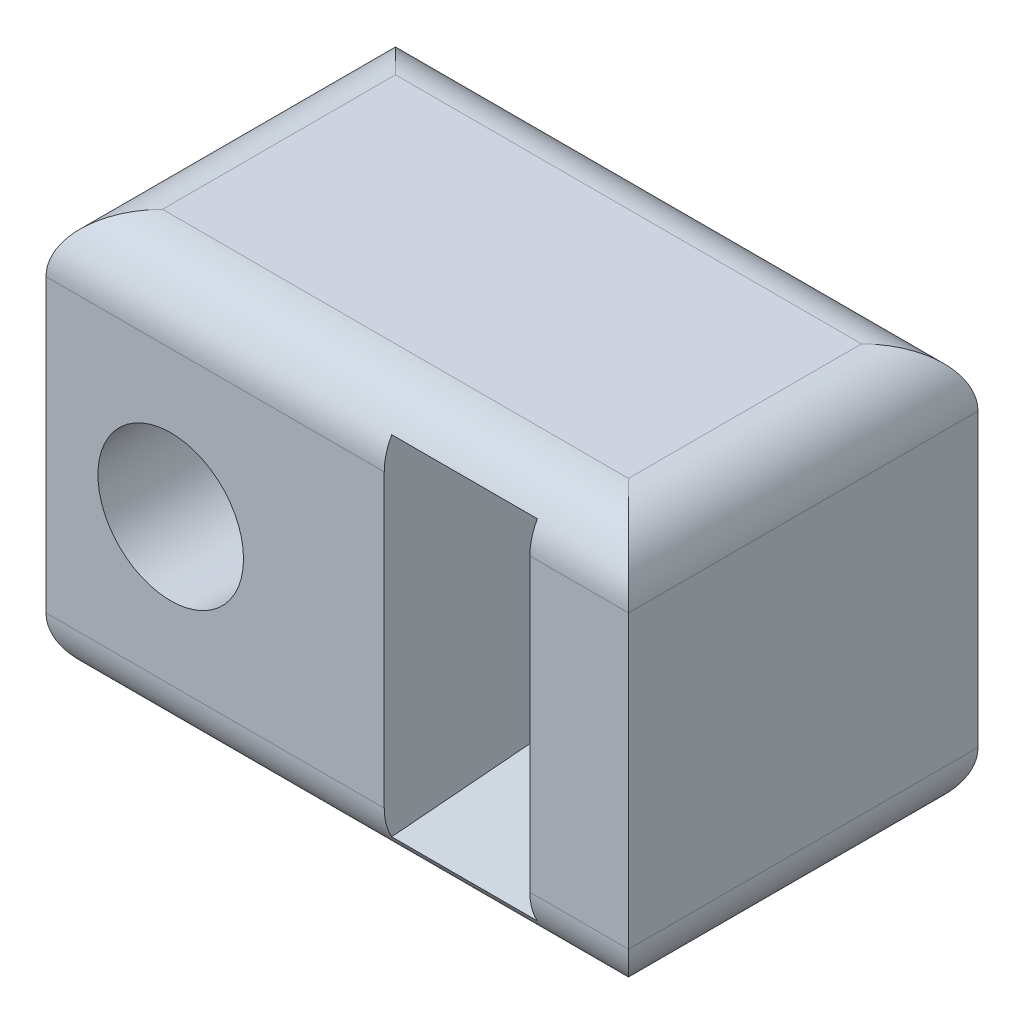
ISO-10303-21;
HEADER;
FILE_DESCRIPTION(('STEP AP214'),'2;1');
FILE_NAME('part.step','',(''),(''),'','','');
FILE_SCHEMA(('AUTOMOTIVE_DESIGN { 1 0 10303 214 1 1 1 1 }'));
ENDSEC;
DATA;
#1=APPLICATION_CONTEXT('core data for automotive mechanical design processes');
#2=APPLICATION_PROTOCOL_DEFINITION('international standard','automotive_design',2000,#1);
#3=PRODUCT_CONTEXT('',#1,'mechanical');
#4=PRODUCT('Part','Part','',(#3));
#5=PRODUCT_RELATED_PRODUCT_CATEGORY('part','',(#4));
#6=PRODUCT_DEFINITION_FORMATION('','',#4);
#7=PRODUCT_DEFINITION_CONTEXT('part definition',#1,'design');
#8=PRODUCT_DEFINITION('design','',#6,#7);
#9=PRODUCT_DEFINITION_SHAPE('','',#8);
#10=(LENGTH_UNIT() NAMED_UNIT(*) SI_UNIT(.MILLI.,.METRE.));
#11=(NAMED_UNIT(*) PLANE_ANGLE_UNIT() SI_UNIT($,.RADIAN.));
#12=(NAMED_UNIT(*) SI_UNIT($,.STERADIAN.) SOLID_ANGLE_UNIT());
#13=UNCERTAINTY_MEASURE_WITH_UNIT(LENGTH_MEASURE(1.E-05),#10,'distance_accuracy_value','');
#14=(GEOMETRIC_REPRESENTATION_CONTEXT(3) GLOBAL_UNCERTAINTY_ASSIGNED_CONTEXT((#13)) GLOBAL_UNIT_ASSIGNED_CONTEXT((#10,
#11,#12)) REPRESENTATION_CONTEXT('',''));
#15=CARTESIAN_POINT('',(0.,0.,0.));
#16=DIRECTION('',(0.,0.,1.));
#17=DIRECTION('',(1.,0.,0.));
#18=AXIS2_PLACEMENT_3D('',#15,#16,#17);
#19=CARTESIAN_POINT('',(0.,0.,6.));
#20=DIRECTION('',(0.,0.,-1.));
#21=DIRECTION('',(-1.,0.,0.));
#22=AXIS2_PLACEMENT_3D('',#19,#20,#21);
#23=PLANE('',#22);
#24=DIRECTION('',(0.,1.,0.));
#25=VECTOR('',#24,1.);
#26=CARTESIAN_POINT('',(5.,-3.5,6.));
#27=LINE('',#26,#25);
#28=CARTESIAN_POINT('',(5.,-2.5,6.));
#29=VERTEX_POINT('',#28);
#30=CARTESIAN_POINT('',(5.,2.5,6.));
#31=VERTEX_POINT('',#30);
#32=EDGE_CURVE('E217',#29,#31,#27,.T.);
#33=ORIENTED_EDGE('',*,*,#32,.T.);
#34=DIRECTION('',(1.,0.,0.));
#35=VECTOR('',#34,1.);
#36=CARTESIAN_POINT('',(-5.,2.5,6.));
#37=LINE('',#36,#35);
#38=CARTESIAN_POINT('',(3.30660422270358,2.5,6.));
#39=VERTEX_POINT('',#38);
#40=EDGE_CURVE('E323',#31,#39,#37,.F.);
#41=ORIENTED_EDGE('',*,*,#40,.T.);
#42=DIRECTION('',(0.,1.,0.));
#43=VECTOR('',#42,1.);
#44=CARTESIAN_POINT('',(3.30660422270358,-3.,6.));
#45=LINE('',#44,#43);
#46=CARTESIAN_POINT('',(3.30660422270358,-2.5,6.));
#47=VERTEX_POINT('',#46);
#48=EDGE_CURVE('E203',#47,#39,#45,.T.);
#49=ORIENTED_EDGE('',*,*,#48,.F.);
#50=DIRECTION('',(1.,0.,0.));
#51=VECTOR('',#50,1.);
#52=CARTESIAN_POINT('',(0.,-2.5,6.));
#53=LINE('',#52,#51);
#54=EDGE_CURVE('E202',#47,#29,#53,.T.);
#55=ORIENTED_EDGE('',*,*,#54,.T.);
#56=EDGE_LOOP('',(#33,#41,#49,#55));
#57=FACE_BOUND('',#56,.T.);
#58=ADVANCED_FACE('F41',(#57),#23,.F.);
#59=CARTESIAN_POINT('',(0.,0.,0.));
#60=DIRECTION('',(0.,0.,-1.));
#61=DIRECTION('',(-1.,0.,0.));
#62=AXIS2_PLACEMENT_3D('',#59,#60,#61);
#63=PLANE('',#62);
#64=DIRECTION('',(0.,1.,0.));
#65=VECTOR('',#64,1.);
#66=CARTESIAN_POINT('',(5.,-3.5,0.));
#67=LINE('',#66,#65);
#68=CARTESIAN_POINT('',(5.,-2.5,0.));
#69=VERTEX_POINT('',#68);
#70=CARTESIAN_POINT('',(5.,2.5,0.));
#71=VERTEX_POINT('',#70);
#72=EDGE_CURVE('E232',#69,#71,#67,.T.);
#73=ORIENTED_EDGE('',*,*,#72,.F.);
#74=DIRECTION('',(1.,0.,0.));
#75=VECTOR('',#74,1.);
#76=CARTESIAN_POINT('',(-5.,-2.5,0.));
#77=LINE('',#76,#75);
#78=CARTESIAN_POINT('',(3.30660422270358,-2.5,0.));
#79=VERTEX_POINT('',#78);
#80=EDGE_CURVE('E181',#69,#79,#77,.F.);
#81=ORIENTED_EDGE('',*,*,#80,.T.);
#82=DIRECTION('',(0.,-1.,0.));
#83=VECTOR('',#82,1.);
#84=CARTESIAN_POINT('',(3.30660422270358,-2.5,0.));
#85=LINE('',#84,#83);
#86=CARTESIAN_POINT('',(3.30660422270358,2.5,0.));
#87=VERTEX_POINT('',#86);
#88=EDGE_CURVE('E157',#87,#79,#85,.T.);
#89=ORIENTED_EDGE('',*,*,#88,.F.);
#90=DIRECTION('',(1.,0.,0.));
#91=VECTOR('',#90,1.);
#92=CARTESIAN_POINT('',(0.,2.5,0.));
#93=LINE('',#92,#91);
#94=EDGE_CURVE('E185',#87,#71,#93,.T.);
#95=ORIENTED_EDGE('',*,*,#94,.T.);
#96=EDGE_LOOP('',(#73,#81,#89,#95));
#97=FACE_BOUND('',#96,.T.);
#98=ADVANCED_FACE('F231',(#97),#63,.T.);
#99=CARTESIAN_POINT('',(-2.85886782280584,0.,6.));
#100=DIRECTION('',(0.,0.,1.));
#101=DIRECTION('',(1.,0.,0.));
#102=AXIS2_PLACEMENT_3D('',#99,#100,#101);
#103=CIRCLE('',#102,1.25);
#104=CARTESIAN_POINT('',(-1.60886782280584,0.,6.));
#105=VERTEX_POINT('',#104);
#106=EDGE_CURVE('E278',#105,#105,#103,.T.);
#107=ORIENTED_EDGE('',*,*,#106,.F.);
#108=EDGE_LOOP('',(#107));
#109=FACE_BOUND('',#108,.T.);
#110=DIRECTION('',(0.,-1.,0.));
#111=VECTOR('',#110,1.);
#112=CARTESIAN_POINT('',(0.806604222703576,-3.,6.));
#113=LINE('',#112,#111);
#114=CARTESIAN_POINT('',(0.806604222703577,2.5,6.));
#115=VERTEX_POINT('',#114);
#116=CARTESIAN_POINT('',(0.806604222703576,-2.5,6.));
#117=VERTEX_POINT('',#116);
#118=EDGE_CURVE('E207',#115,#117,#113,.T.);
#119=ORIENTED_EDGE('',*,*,#118,.F.);
#120=DIRECTION('',(1.,0.,0.));
#121=VECTOR('',#120,1.);
#122=CARTESIAN_POINT('',(-5.,2.5,6.));
#123=LINE('',#122,#121);
#124=CARTESIAN_POINT('',(-5.,2.5,6.));
#125=VERTEX_POINT('',#124);
#126=EDGE_CURVE('E328',#115,#125,#123,.F.);
#127=ORIENTED_EDGE('',*,*,#126,.T.);
#128=DIRECTION('',(0.,1.,0.));
#129=VECTOR('',#128,1.);
#130=CARTESIAN_POINT('',(-5.,-3.5,6.));
#131=LINE('',#130,#129);
#132=CARTESIAN_POINT('',(-5.,-2.5,6.));
#133=VERTEX_POINT('',#132);
#134=EDGE_CURVE('E242',#133,#125,#131,.T.);
#135=ORIENTED_EDGE('',*,*,#134,.F.);
#136=DIRECTION('',(1.,0.,0.));
#137=VECTOR('',#136,1.);
#138=CARTESIAN_POINT('',(0.,-2.5,6.));
#139=LINE('',#138,#137);
#140=EDGE_CURVE('E331',#133,#117,#139,.T.);
#141=ORIENTED_EDGE('',*,*,#140,.T.);
#142=EDGE_LOOP('',(#119,#127,#135,#141));
#143=FACE_BOUND('',#142,.T.);
#144=ADVANCED_FACE('F350',(#109,#143),#23,.F.);
#145=CARTESIAN_POINT('',(-2.85886782280584,0.,0.));
#146=DIRECTION('',(0.,0.,1.));
#147=DIRECTION('',(1.,0.,0.));
#148=AXIS2_PLACEMENT_3D('',#145,#146,#147);
#149=CIRCLE('',#148,1.25);
#150=CARTESIAN_POINT('',(-1.60886782280584,0.,0.));
#151=VERTEX_POINT('',#150);
#152=EDGE_CURVE('E174',#151,#151,#149,.T.);
#153=ORIENTED_EDGE('',*,*,#152,.T.);
#154=EDGE_LOOP('',(#153));
#155=FACE_BOUND('',#154,.T.);
#156=DIRECTION('',(0.,1.,0.));
#157=VECTOR('',#156,1.);
#158=CARTESIAN_POINT('',(0.806604222703576,-2.5,0.));
#159=LINE('',#158,#157);
#160=CARTESIAN_POINT('',(0.806604222703576,-2.5,0.));
#161=VERTEX_POINT('',#160);
#162=CARTESIAN_POINT('',(0.806604222703576,2.5,0.));
#163=VERTEX_POINT('',#162);
#164=EDGE_CURVE('E162',#161,#163,#159,.T.);
#165=ORIENTED_EDGE('',*,*,#164,.F.);
#166=DIRECTION('',(1.,0.,0.));
#167=VECTOR('',#166,1.);
#168=CARTESIAN_POINT('',(-5.,-2.5,0.));
#169=LINE('',#168,#167);
#170=CARTESIAN_POINT('',(-5.,-2.5,0.));
#171=VERTEX_POINT('',#170);
#172=EDGE_CURVE('E169',#161,#171,#169,.F.);
#173=ORIENTED_EDGE('',*,*,#172,.T.);
#174=DIRECTION('',(0.,1.,0.));
#175=VECTOR('',#174,1.);
#176=CARTESIAN_POINT('',(-5.,-3.5,0.));
#177=LINE('',#176,#175);
#178=CARTESIAN_POINT('',(-5.,2.5,0.));
#179=VERTEX_POINT('',#178);
#180=EDGE_CURVE('E243',#171,#179,#177,.T.);
#181=ORIENTED_EDGE('',*,*,#180,.T.);
#182=DIRECTION('',(1.,0.,0.));
#183=VECTOR('',#182,1.);
#184=CARTESIAN_POINT('',(0.,2.5,0.));
#185=LINE('',#184,#183);
#186=EDGE_CURVE('E172',#179,#163,#185,.T.);
#187=ORIENTED_EDGE('',*,*,#186,.T.);
#188=EDGE_LOOP('',(#165,#173,#181,#187));
#189=FACE_BOUND('',#188,.T.);
#190=ADVANCED_FACE('F167',(#155,#189),#63,.T.);
#191=CARTESIAN_POINT('',(-5.,-3.5,6.));
#192=DIRECTION('',(-1.,0.,0.));
#193=DIRECTION('',(0.,0.,1.));
#194=AXIS2_PLACEMENT_3D('',#191,#192,#193);
#195=PLANE('',#194);
#196=ORIENTED_EDGE('',*,*,#180,.F.);
#197=DIRECTION('',(0.,0.,-1.));
#198=VECTOR('',#197,1.);
#199=CARTESIAN_POINT('',(-5.,-2.5,6.));
#200=LINE('',#199,#198);
#201=EDGE_CURVE('E253',#171,#133,#200,.F.);
#202=ORIENTED_EDGE('',*,*,#201,.T.);
#203=ORIENTED_EDGE('',*,*,#134,.T.);
#204=DIRECTION('',(0.,0.,-1.));
#205=VECTOR('',#204,1.);
#206=CARTESIAN_POINT('',(-5.,2.5,6.));
#207=LINE('',#206,#205);
#208=EDGE_CURVE('E342',#125,#179,#207,.T.);
#209=ORIENTED_EDGE('',*,*,#208,.T.);
#210=EDGE_LOOP('',(#196,#202,#203,#209));
#211=FACE_BOUND('',#210,.T.);
#212=ADVANCED_FACE('F346',(#211),#195,.T.);
#213=CARTESIAN_POINT('',(-5.,-3.5,6.));
#214=DIRECTION('',(0.,1.,0.));
#215=DIRECTION('',(0.,0.,1.));
#216=AXIS2_PLACEMENT_3D('',#213,#214,#215);
#217=PLANE('',#216);
#218=DIRECTION('',(1.,0.,0.));
#219=VECTOR('',#218,1.);
#220=CARTESIAN_POINT('',(-5.,-3.5,5.));
#221=LINE('',#220,#219);
#222=CARTESIAN_POINT('',(4.,-3.5,5.));
#223=VERTEX_POINT('',#222);
#224=CARTESIAN_POINT('',(-4.,-3.5,5.));
#225=VERTEX_POINT('',#224);
#226=EDGE_CURVE('E216',#223,#225,#221,.F.);
#227=ORIENTED_EDGE('',*,*,#226,.T.);
#228=DIRECTION('',(0.,0.,-1.));
#229=VECTOR('',#228,1.);
#230=CARTESIAN_POINT('',(-4.,-3.5,0.));
#231=LINE('',#230,#229);
#232=CARTESIAN_POINT('',(-4.,-3.5,1.));
#233=VERTEX_POINT('',#232);
#234=EDGE_CURVE('E222',#225,#233,#231,.T.);
#235=ORIENTED_EDGE('',*,*,#234,.T.);
#236=DIRECTION('',(1.,0.,0.));
#237=VECTOR('',#236,1.);
#238=CARTESIAN_POINT('',(5.,-3.5,1.));
#239=LINE('',#238,#237);
#240=CARTESIAN_POINT('',(4.,-3.5,1.));
#241=VERTEX_POINT('',#240);
#242=EDGE_CURVE('E219',#233,#241,#239,.T.);
#243=ORIENTED_EDGE('',*,*,#242,.T.);
#244=DIRECTION('',(0.,0.,-1.));
#245=VECTOR('',#244,1.);
#246=CARTESIAN_POINT('',(4.,-3.5,6.));
#247=LINE('',#246,#245);
#248=EDGE_CURVE('E214',#241,#223,#247,.F.);
#249=ORIENTED_EDGE('',*,*,#248,.T.);
#250=EDGE_LOOP('',(#227,#235,#243,#249));
#251=FACE_BOUND('',#250,.T.);
#252=ADVANCED_FACE('F359',(#251),#217,.F.);
#253=CARTESIAN_POINT('',(5.,-3.5,6.));
#254=DIRECTION('',(-1.,0.,0.));
#255=DIRECTION('',(0.,0.,1.));
#256=AXIS2_PLACEMENT_3D('',#253,#254,#255);
#257=PLANE('',#256);
#258=ORIENTED_EDGE('',*,*,#32,.F.);
#259=DIRECTION('',(0.,0.,-1.));
#260=VECTOR('',#259,1.);
#261=CARTESIAN_POINT('',(5.,-2.5,6.));
#262=LINE('',#261,#260);
#263=EDGE_CURVE('E12',#29,#69,#262,.T.);
#264=ORIENTED_EDGE('',*,*,#263,.T.);
#265=ORIENTED_EDGE('',*,*,#72,.T.);
#266=DIRECTION('',(0.,0.,-1.));
#267=VECTOR('',#266,1.);
#268=CARTESIAN_POINT('',(5.,2.5,6.));
#269=LINE('',#268,#267);
#270=EDGE_CURVE('E50',#71,#31,#269,.F.);
#271=ORIENTED_EDGE('',*,*,#270,.T.);
#272=EDGE_LOOP('',(#258,#264,#265,#271));
#273=FACE_BOUND('',#272,.T.);
#274=ADVANCED_FACE('F239',(#273),#257,.F.);
#275=CARTESIAN_POINT('',(-5.,3.5,6.));
#276=DIRECTION('',(0.,1.,0.));
#277=DIRECTION('',(0.,0.,1.));
#278=AXIS2_PLACEMENT_3D('',#275,#276,#277);
#279=PLANE('',#278);
#280=DIRECTION('',(1.,0.,0.));
#281=VECTOR('',#280,1.);
#282=CARTESIAN_POINT('',(-5.,3.5,1.));
#283=LINE('',#282,#281);
#284=CARTESIAN_POINT('',(4.,3.5,1.));
#285=VERTEX_POINT('',#284);
#286=CARTESIAN_POINT('',(-4.,3.5,1.));
#287=VERTEX_POINT('',#286);
#288=EDGE_CURVE('E197',#285,#287,#283,.F.);
#289=ORIENTED_EDGE('',*,*,#288,.T.);
#290=DIRECTION('',(0.,0.,-1.));
#291=VECTOR('',#290,1.);
#292=CARTESIAN_POINT('',(-4.,3.5,6.));
#293=LINE('',#292,#291);
#294=CARTESIAN_POINT('',(-4.,3.5,5.));
#295=VERTEX_POINT('',#294);
#296=EDGE_CURVE('E200',#287,#295,#293,.F.);
#297=ORIENTED_EDGE('',*,*,#296,.T.);
#298=DIRECTION('',(1.,0.,0.));
#299=VECTOR('',#298,1.);
#300=CARTESIAN_POINT('',(5.,3.5,5.));
#301=LINE('',#300,#299);
#302=CARTESIAN_POINT('',(4.,3.5,5.));
#303=VERTEX_POINT('',#302);
#304=EDGE_CURVE('E195',#295,#303,#301,.T.);
#305=ORIENTED_EDGE('',*,*,#304,.T.);
#306=DIRECTION('',(0.,0.,-1.));
#307=VECTOR('',#306,1.);
#308=CARTESIAN_POINT('',(4.,3.5,0.));
#309=LINE('',#308,#307);
#310=EDGE_CURVE('E183',#303,#285,#309,.T.);
#311=ORIENTED_EDGE('',*,*,#310,.T.);
#312=EDGE_LOOP('',(#289,#297,#305,#311));
#313=FACE_BOUND('',#312,.T.);
#314=ADVANCED_FACE('F319',(#313),#279,.T.);
#315=CARTESIAN_POINT('',(0.,2.48275862068966,-0.206896551724138));
#316=DIRECTION('',(0.,-0.99654575824488,0.08304547985374));
#317=DIRECTION('',(0.,-0.08304547985374,-0.99654575824488));
#318=AXIS2_PLACEMENT_3D('',#315,#316,#317);
#319=PLANE('',#318);
#320=DIRECTION('',(0.,0.08304547985374,0.99654575824488));
#321=VECTOR('',#320,1.);
#322=CARTESIAN_POINT('',(3.30660422270358,2.5,0.));
#323=LINE('',#322,#321);
#324=CARTESIAN_POINT('',(3.30660422270358,2.98934104241451,5.87209250897407));
#325=VERTEX_POINT('',#324);
#326=EDGE_CURVE('E163',#87,#325,#323,.T.);
#327=ORIENTED_EDGE('',*,*,#326,.T.);
#328=DIRECTION('',(-1.,0.,0.));
#329=VECTOR('',#328,1.);
#330=CARTESIAN_POINT('',(3.30660422270358,2.98934104241451,5.87209250897407));
#331=LINE('',#330,#329);
#332=CARTESIAN_POINT('',(0.806604222703577,2.98934104241451,5.87209250897407));
#333=VERTEX_POINT('',#332);
#334=EDGE_CURVE('E66',#325,#333,#331,.T.);
#335=ORIENTED_EDGE('',*,*,#334,.T.);
#336=DIRECTION('',(0.,0.08304547985374,0.99654575824488));
#337=VECTOR('',#336,1.);
#338=CARTESIAN_POINT('',(0.806604222703576,2.5,0.));
#339=LINE('',#338,#337);
#340=EDGE_CURVE('E156',#163,#333,#339,.T.);
#341=ORIENTED_EDGE('',*,*,#340,.F.);
#342=DIRECTION('',(1.,0.,0.));
#343=VECTOR('',#342,1.);
#344=CARTESIAN_POINT('',(3.30660422270358,2.5,0.));
#345=LINE('',#344,#343);
#346=EDGE_CURVE('E173',#163,#87,#345,.T.);
#347=ORIENTED_EDGE('',*,*,#346,.T.);
#348=EDGE_LOOP('',(#327,#335,#341,#347));
#349=FACE_BOUND('',#348,.T.);
#350=ADVANCED_FACE('F314',(#349),#319,.T.);
#351=CARTESIAN_POINT('',(3.30660422270358,0.,0.));
#352=DIRECTION('',(-1.,0.,0.));
#353=DIRECTION('',(0.,0.,1.));
#354=AXIS2_PLACEMENT_3D('',#351,#352,#353);
#355=PLANE('',#354);
#356=ORIENTED_EDGE('',*,*,#48,.T.);
#357=CARTESIAN_POINT('',(3.30660422270358,2.5,5.));
#358=DIRECTION('',(-1.,0.,0.));
#359=DIRECTION('',(0.,0.,1.));
#360=AXIS2_PLACEMENT_3D('',#357,#358,#359);
#361=CIRCLE('',#360,1.);
#362=EDGE_CURVE('E324',#39,#325,#361,.T.);
#363=ORIENTED_EDGE('',*,*,#362,.T.);
#364=ORIENTED_EDGE('',*,*,#326,.F.);
#365=ORIENTED_EDGE('',*,*,#88,.T.);
#366=DIRECTION('',(0.,-0.08304547985374,0.99654575824488));
#367=VECTOR('',#366,1.);
#368=CARTESIAN_POINT('',(3.30660422270358,-2.5,0.));
#369=LINE('',#368,#367);
#370=CARTESIAN_POINT('',(3.30660422270358,-2.98934104241451,5.87209250897407));
#371=VERTEX_POINT('',#370);
#372=EDGE_CURVE('E151',#79,#371,#369,.T.);
#373=ORIENTED_EDGE('',*,*,#372,.T.);
#374=CARTESIAN_POINT('',(3.30660422270358,-2.5,5.));
#375=DIRECTION('',(-1.,0.,0.));
#376=DIRECTION('',(0.,0.,1.));
#377=AXIS2_PLACEMENT_3D('',#374,#375,#376);
#378=CIRCLE('',#377,1.);
#379=EDGE_CURVE('E327',#371,#47,#378,.T.);
#380=ORIENTED_EDGE('',*,*,#379,.T.);
#381=EDGE_LOOP('',(#356,#363,#364,#365,#373,#380));
#382=FACE_BOUND('',#381,.T.);
#383=ADVANCED_FACE('F460',(#382),#355,.T.);
#384=CARTESIAN_POINT('',(0.806604222703576,0.,0.));
#385=DIRECTION('',(1.,0.,0.));
#386=DIRECTION('',(0.,0.,-1.));
#387=AXIS2_PLACEMENT_3D('',#384,#385,#386);
#388=PLANE('',#387);
#389=ORIENTED_EDGE('',*,*,#340,.T.);
#390=CARTESIAN_POINT('',(0.806604222703577,2.5,5.));
#391=DIRECTION('',(1.,0.,0.));
#392=DIRECTION('',(0.,0.,-1.));
#393=AXIS2_PLACEMENT_3D('',#390,#391,#392);
#394=CIRCLE('',#393,1.);
#395=EDGE_CURVE('E338',#333,#115,#394,.T.);
#396=ORIENTED_EDGE('',*,*,#395,.T.);
#397=ORIENTED_EDGE('',*,*,#118,.T.);
#398=CARTESIAN_POINT('',(0.806604222703576,-2.5,5.));
#399=DIRECTION('',(1.,0.,0.));
#400=DIRECTION('',(0.,0.,-1.));
#401=AXIS2_PLACEMENT_3D('',#398,#399,#400);
#402=CIRCLE('',#401,1.);
#403=CARTESIAN_POINT('',(0.806604222703576,-2.98934104241451,5.87209250897407));
#404=VERTEX_POINT('',#403);
#405=EDGE_CURVE('E58',#117,#404,#402,.T.);
#406=ORIENTED_EDGE('',*,*,#405,.T.);
#407=DIRECTION('',(0.,-0.08304547985374,0.99654575824488));
#408=VECTOR('',#407,1.);
#409=CARTESIAN_POINT('',(0.806604222703576,-2.5,0.));
#410=LINE('',#409,#408);
#411=EDGE_CURVE('E148',#161,#404,#410,.T.);
#412=ORIENTED_EDGE('',*,*,#411,.F.);
#413=ORIENTED_EDGE('',*,*,#164,.T.);
#414=EDGE_LOOP('',(#389,#396,#397,#406,#412,#413));
#415=FACE_BOUND('',#414,.T.);
#416=ADVANCED_FACE('F161',(#415),#388,.T.);
#417=CARTESIAN_POINT('',(0.,-2.48275862068966,-0.206896551724138));
#418=DIRECTION('',(0.,0.99654575824488,0.08304547985374));
#419=DIRECTION('',(0.,-0.08304547985374,0.99654575824488));
#420=AXIS2_PLACEMENT_3D('',#417,#418,#419);
#421=PLANE('',#420);
#422=ORIENTED_EDGE('',*,*,#411,.T.);
#423=DIRECTION('',(1.,0.,0.));
#424=VECTOR('',#423,1.);
#425=CARTESIAN_POINT('',(0.806604222703576,-2.98934104241451,5.87209250897407));
#426=LINE('',#425,#424);
#427=EDGE_CURVE('E340',#404,#371,#426,.T.);
#428=ORIENTED_EDGE('',*,*,#427,.T.);
#429=ORIENTED_EDGE('',*,*,#372,.F.);
#430=DIRECTION('',(-1.,0.,0.));
#431=VECTOR('',#430,1.);
#432=CARTESIAN_POINT('',(3.30660422270358,-2.5,0.));
#433=LINE('',#432,#431);
#434=EDGE_CURVE('E146',#79,#161,#433,.T.);
#435=ORIENTED_EDGE('',*,*,#434,.T.);
#436=EDGE_LOOP('',(#422,#428,#429,#435));
#437=FACE_BOUND('',#436,.T.);
#438=ADVANCED_FACE('F147',(#437),#421,.T.);
#439=CARTESIAN_POINT('',(-2.85886782280584,0.,0.));
#440=DIRECTION('',(0.,0.,1.));
#441=DIRECTION('',(1.,0.,0.));
#442=AXIS2_PLACEMENT_3D('',#439,#440,#441);
#443=CYLINDRICAL_SURFACE('',#442,1.25);
#444=ORIENTED_EDGE('',*,*,#152,.F.);
#445=EDGE_LOOP('',(#444));
#446=FACE_BOUND('',#445,.T.);
#447=ORIENTED_EDGE('',*,*,#106,.T.);
#448=EDGE_LOOP('',(#447));
#449=FACE_BOUND('',#448,.T.);
#450=ADVANCED_FACE('F368',(#446,#449),#443,.F.);
#451=CARTESIAN_POINT('',(0.,-2.5,5.));
#452=DIRECTION('',(1.,0.,0.));
#453=DIRECTION('',(0.,0.,-1.));
#454=AXIS2_PLACEMENT_3D('',#451,#452,#453);
#455=CYLINDRICAL_SURFACE('',#454,1.);
#456=ORIENTED_EDGE('',*,*,#405,.F.);
#457=ORIENTED_EDGE('',*,*,#140,.F.);
#458=CARTESIAN_POINT('',(-4.,-2.5,5.));
#459=DIRECTION('',(0.707106781186547,0.,0.707106781186547));
#460=DIRECTION('',(-0.707106781186547,0.,0.707106781186547));
#461=AXIS2_PLACEMENT_3D('',#458,#459,#460);
#462=ELLIPSE('',#461,1.41421356237309,1.);
#463=EDGE_CURVE('E261',#225,#133,#462,.F.);
#464=ORIENTED_EDGE('',*,*,#463,.F.);
#465=ORIENTED_EDGE('',*,*,#226,.F.);
#466=CARTESIAN_POINT('',(4.,-2.5,5.));
#467=DIRECTION('',(0.707106781186547,0.,-0.707106781186547));
#468=DIRECTION('',(-0.707106781186547,0.,-0.707106781186547));
#469=AXIS2_PLACEMENT_3D('',#466,#467,#468);
#470=ELLIPSE('',#469,1.41421356237309,1.);
#471=EDGE_CURVE('E272',#29,#223,#470,.T.);
#472=ORIENTED_EDGE('',*,*,#471,.F.);
#473=ORIENTED_EDGE('',*,*,#54,.F.);
#474=ORIENTED_EDGE('',*,*,#379,.F.);
#475=ORIENTED_EDGE('',*,*,#427,.F.);
#476=EDGE_LOOP('',(#456,#457,#464,#465,#472,#473,#474,#475));
#477=FACE_BOUND('',#476,.T.);
#478=ADVANCED_FACE('F353',(#477),#455,.T.);
#479=CARTESIAN_POINT('',(-4.,-2.5,6.));
#480=DIRECTION('',(0.,0.,1.));
#481=DIRECTION('',(1.,0.,0.));
#482=AXIS2_PLACEMENT_3D('',#479,#480,#481);
#483=CYLINDRICAL_SURFACE('',#482,1.);
#484=ORIENTED_EDGE('',*,*,#463,.T.);
#485=ORIENTED_EDGE('',*,*,#201,.F.);
#486=CARTESIAN_POINT('',(-4.,-2.5,1.));
#487=DIRECTION('',(-0.707106781186547,0.,0.707106781186547));
#488=DIRECTION('',(0.707106781186547,0.,0.707106781186547));
#489=AXIS2_PLACEMENT_3D('',#486,#487,#488);
#490=ELLIPSE('',#489,1.41421356237309,1.);
#491=EDGE_CURVE('E180',#233,#171,#490,.F.);
#492=ORIENTED_EDGE('',*,*,#491,.F.);
#493=ORIENTED_EDGE('',*,*,#234,.F.);
#494=EDGE_LOOP('',(#484,#485,#492,#493));
#495=FACE_BOUND('',#494,.T.);
#496=ADVANCED_FACE('F360',(#495),#483,.T.);
#497=CARTESIAN_POINT('',(4.,-2.5,6.));
#498=DIRECTION('',(0.,0.,-1.));
#499=DIRECTION('',(-1.,0.,0.));
#500=AXIS2_PLACEMENT_3D('',#497,#498,#499);
#501=CYLINDRICAL_SURFACE('',#500,1.);
#502=ORIENTED_EDGE('',*,*,#471,.T.);
#503=ORIENTED_EDGE('',*,*,#248,.F.);
#504=CARTESIAN_POINT('',(4.,-2.5,1.));
#505=DIRECTION('',(-0.707106781186547,0.,-0.707106781186547));
#506=DIRECTION('',(0.707106781186547,0.,-0.707106781186547));
#507=AXIS2_PLACEMENT_3D('',#504,#505,#506);
#508=ELLIPSE('',#507,1.41421356237309,1.);
#509=EDGE_CURVE('E264',#69,#241,#508,.T.);
#510=ORIENTED_EDGE('',*,*,#509,.F.);
#511=ORIENTED_EDGE('',*,*,#263,.F.);
#512=EDGE_LOOP('',(#502,#503,#510,#511));
#513=FACE_BOUND('',#512,.T.);
#514=ADVANCED_FACE('F357',(#513),#501,.T.);
#515=CARTESIAN_POINT('',(-5.,-2.5,1.));
#516=DIRECTION('',(-1.,0.,0.));
#517=DIRECTION('',(0.,0.,1.));
#518=AXIS2_PLACEMENT_3D('',#515,#516,#517);
#519=CYLINDRICAL_SURFACE('',#518,1.);
#520=ORIENTED_EDGE('',*,*,#434,.F.);
#521=ORIENTED_EDGE('',*,*,#80,.F.);
#522=ORIENTED_EDGE('',*,*,#509,.T.);
#523=ORIENTED_EDGE('',*,*,#242,.F.);
#524=ORIENTED_EDGE('',*,*,#491,.T.);
#525=ORIENTED_EDGE('',*,*,#172,.F.);
#526=EDGE_LOOP('',(#520,#521,#522,#523,#524,#525));
#527=FACE_BOUND('',#526,.T.);
#528=ADVANCED_FACE('F177',(#527),#519,.T.);
#529=CARTESIAN_POINT('',(-5.,2.5,5.));
#530=DIRECTION('',(-1.,0.,0.));
#531=DIRECTION('',(0.,0.,1.));
#532=AXIS2_PLACEMENT_3D('',#529,#530,#531);
#533=CYLINDRICAL_SURFACE('',#532,1.);
#534=CARTESIAN_POINT('',(4.,2.5,5.));
#535=DIRECTION('',(-0.707106781186547,0.,0.707106781186547));
#536=DIRECTION('',(0.707106781186547,0.,0.707106781186547));
#537=AXIS2_PLACEMENT_3D('',#534,#535,#536);
#538=ELLIPSE('',#537,1.41421356237309,1.);
#539=EDGE_CURVE('E252',#303,#31,#538,.F.);
#540=ORIENTED_EDGE('',*,*,#539,.F.);
#541=ORIENTED_EDGE('',*,*,#304,.F.);
#542=CARTESIAN_POINT('',(-4.,2.5,5.));
#543=DIRECTION('',(-0.707106781186547,0.,-0.707106781186547));
#544=DIRECTION('',(0.707106781186547,0.,-0.707106781186547));
#545=AXIS2_PLACEMENT_3D('',#542,#543,#544);
#546=ELLIPSE('',#545,1.41421356237309,1.);
#547=EDGE_CURVE('E45',#125,#295,#546,.T.);
#548=ORIENTED_EDGE('',*,*,#547,.F.);
#549=ORIENTED_EDGE('',*,*,#126,.F.);
#550=ORIENTED_EDGE('',*,*,#395,.F.);
#551=ORIENTED_EDGE('',*,*,#334,.F.);
#552=ORIENTED_EDGE('',*,*,#362,.F.);
#553=ORIENTED_EDGE('',*,*,#40,.F.);
#554=EDGE_LOOP('',(#540,#541,#548,#549,#550,#551,#552,#553));
#555=FACE_BOUND('',#554,.T.);
#556=ADVANCED_FACE('F43',(#555),#533,.T.);
#557=CARTESIAN_POINT('',(-4.,2.5,6.));
#558=DIRECTION('',(0.,0.,-1.));
#559=DIRECTION('',(-1.,0.,0.));
#560=AXIS2_PLACEMENT_3D('',#557,#558,#559);
#561=CYLINDRICAL_SURFACE('',#560,1.);
#562=ORIENTED_EDGE('',*,*,#547,.T.);
#563=ORIENTED_EDGE('',*,*,#296,.F.);
#564=CARTESIAN_POINT('',(-4.,2.5,1.));
#565=DIRECTION('',(0.707106781186547,0.,-0.707106781186547));
#566=DIRECTION('',(-0.707106781186547,0.,-0.707106781186547));
#567=AXIS2_PLACEMENT_3D('',#564,#565,#566);
#568=ELLIPSE('',#567,1.41421356237309,1.);
#569=EDGE_CURVE('E257',#179,#287,#568,.T.);
#570=ORIENTED_EDGE('',*,*,#569,.F.);
#571=ORIENTED_EDGE('',*,*,#208,.F.);
#572=EDGE_LOOP('',(#562,#563,#570,#571));
#573=FACE_BOUND('',#572,.T.);
#574=ADVANCED_FACE('F316',(#573),#561,.T.);
#575=CARTESIAN_POINT('',(4.,2.5,6.));
#576=DIRECTION('',(0.,0.,1.));
#577=DIRECTION('',(1.,0.,0.));
#578=AXIS2_PLACEMENT_3D('',#575,#576,#577);
#579=CYLINDRICAL_SURFACE('',#578,1.);
#580=ORIENTED_EDGE('',*,*,#539,.T.);
#581=ORIENTED_EDGE('',*,*,#270,.F.);
#582=CARTESIAN_POINT('',(4.,2.5,1.));
#583=DIRECTION('',(0.707106781186547,0.,0.707106781186547));
#584=DIRECTION('',(-0.707106781186547,0.,0.707106781186547));
#585=AXIS2_PLACEMENT_3D('',#582,#583,#584);
#586=ELLIPSE('',#585,1.41421356237309,1.);
#587=EDGE_CURVE('E250',#285,#71,#586,.F.);
#588=ORIENTED_EDGE('',*,*,#587,.F.);
#589=ORIENTED_EDGE('',*,*,#310,.F.);
#590=EDGE_LOOP('',(#580,#581,#588,#589));
#591=FACE_BOUND('',#590,.T.);
#592=ADVANCED_FACE('F248',(#591),#579,.T.);
#593=CARTESIAN_POINT('',(0.,2.5,1.));
#594=DIRECTION('',(1.,0.,0.));
#595=DIRECTION('',(0.,0.,-1.));
#596=AXIS2_PLACEMENT_3D('',#593,#594,#595);
#597=CYLINDRICAL_SURFACE('',#596,1.);
#598=ORIENTED_EDGE('',*,*,#569,.T.);
#599=ORIENTED_EDGE('',*,*,#288,.F.);
#600=ORIENTED_EDGE('',*,*,#587,.T.);
#601=ORIENTED_EDGE('',*,*,#94,.F.);
#602=ORIENTED_EDGE('',*,*,#346,.F.);
#603=ORIENTED_EDGE('',*,*,#186,.F.);
#604=EDGE_LOOP('',(#598,#599,#600,#601,#602,#603));
#605=FACE_BOUND('',#604,.T.);
#606=ADVANCED_FACE('F256',(#605),#597,.T.);
#607=CLOSED_SHELL('',(#58,#98,#144,#190,#212,#252,#274,#314,#350,#383,#416,#438,#450,#478,#496,
#514,#528,#556,#574,#592,#606));
#608=MANIFOLD_SOLID_BREP('B2',#607);
#609=ADVANCED_BREP_SHAPE_REPRESENTATION('',(#18,#608),#14);
#610=SHAPE_DEFINITION_REPRESENTATION(#9,#609);
ENDSEC;
END-ISO-10303-21;
